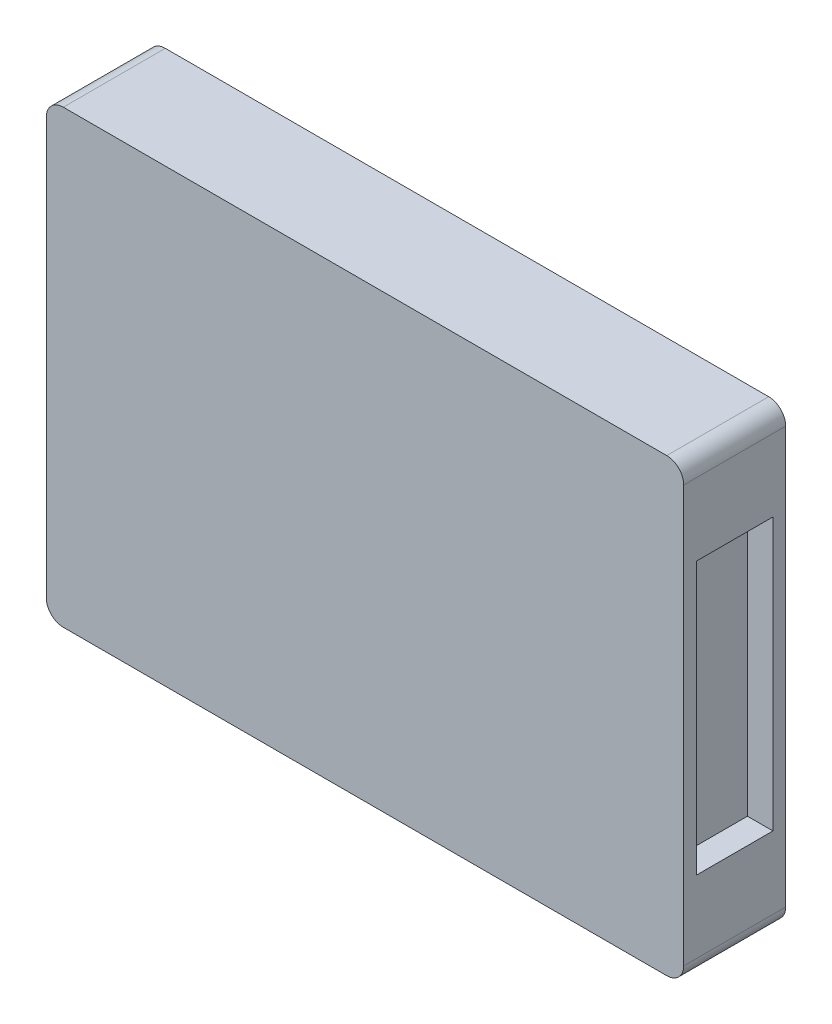
ISO-10303-21;
HEADER;
FILE_DESCRIPTION(('STEP AP214'),'2;1');
FILE_NAME('part.step','',(''),(''),'','','');
FILE_SCHEMA(('AUTOMOTIVE_DESIGN { 1 0 10303 214 1 1 1 1 }'));
ENDSEC;
DATA;
#1=APPLICATION_CONTEXT('core data for automotive mechanical design processes');
#2=APPLICATION_PROTOCOL_DEFINITION('international standard','automotive_design',2000,#1);
#3=PRODUCT_CONTEXT('',#1,'mechanical');
#4=PRODUCT('Part','Part','',(#3));
#5=PRODUCT_RELATED_PRODUCT_CATEGORY('part','',(#4));
#6=PRODUCT_DEFINITION_FORMATION('','',#4);
#7=PRODUCT_DEFINITION_CONTEXT('part definition',#1,'design');
#8=PRODUCT_DEFINITION('design','',#6,#7);
#9=PRODUCT_DEFINITION_SHAPE('','',#8);
#10=(LENGTH_UNIT() NAMED_UNIT(*) SI_UNIT(.MILLI.,.METRE.));
#11=(NAMED_UNIT(*) PLANE_ANGLE_UNIT() SI_UNIT($,.RADIAN.));
#12=(NAMED_UNIT(*) SI_UNIT($,.STERADIAN.) SOLID_ANGLE_UNIT());
#13=UNCERTAINTY_MEASURE_WITH_UNIT(LENGTH_MEASURE(1.E-05),#10,'distance_accuracy_value','');
#14=(GEOMETRIC_REPRESENTATION_CONTEXT(3) GLOBAL_UNCERTAINTY_ASSIGNED_CONTEXT((#13)) GLOBAL_UNIT_ASSIGNED_CONTEXT((#10,
#11,#12)) REPRESENTATION_CONTEXT('',''));
#15=CARTESIAN_POINT('',(0.,0.,0.));
#16=DIRECTION('',(0.,0.,1.));
#17=DIRECTION('',(1.,0.,0.));
#18=AXIS2_PLACEMENT_3D('',#15,#16,#17);
#19=CARTESIAN_POINT('',(-37.5,-26.5,12.));
#20=DIRECTION('',(1.,0.,0.));
#21=DIRECTION('',(0.,0.,-1.));
#22=AXIS2_PLACEMENT_3D('',#19,#20,#21);
#23=PLANE('',#22);
#24=DIRECTION('',(0.,1.,0.));
#25=VECTOR('',#24,1.);
#26=CARTESIAN_POINT('',(-37.5,-4.,8.5));
#27=LINE('',#26,#25);
#28=CARTESIAN_POINT('',(-37.5,-4.,8.5));
#29=VERTEX_POINT('',#28);
#30=CARTESIAN_POINT('',(-37.5,4.,8.5));
#31=VERTEX_POINT('',#30);
#32=EDGE_CURVE('E188',#29,#31,#27,.T.);
#33=ORIENTED_EDGE('',*,*,#32,.F.);
#34=CARTESIAN_POINT('',(-37.5,-4.,6.));
#35=DIRECTION('',(-1.,0.,0.));
#36=DIRECTION('',(0.,0.,1.));
#37=AXIS2_PLACEMENT_3D('',#34,#35,#36);
#38=CIRCLE('',#37,2.5);
#39=CARTESIAN_POINT('',(-37.5,-4.,3.5));
#40=VERTEX_POINT('',#39);
#41=EDGE_CURVE('E55',#40,#29,#38,.T.);
#42=ORIENTED_EDGE('',*,*,#41,.F.);
#43=DIRECTION('',(0.,-1.,0.));
#44=VECTOR('',#43,1.);
#45=CARTESIAN_POINT('',(-37.5,-4.,3.5));
#46=LINE('',#45,#44);
#47=CARTESIAN_POINT('',(-37.5,4.,3.5));
#48=VERTEX_POINT('',#47);
#49=EDGE_CURVE('E175',#48,#40,#46,.T.);
#50=ORIENTED_EDGE('',*,*,#49,.F.);
#51=CARTESIAN_POINT('',(-37.5,4.,6.));
#52=DIRECTION('',(-1.,0.,0.));
#53=DIRECTION('',(0.,0.,1.));
#54=AXIS2_PLACEMENT_3D('',#51,#52,#53);
#55=CIRCLE('',#54,2.5);
#56=EDGE_CURVE('E179',#31,#48,#55,.T.);
#57=ORIENTED_EDGE('',*,*,#56,.F.);
#58=EDGE_LOOP('',(#33,#42,#50,#57));
#59=FACE_BOUND('',#58,.T.);
#60=DIRECTION('',(0.,-1.,0.));
#61=VECTOR('',#60,1.);
#62=CARTESIAN_POINT('',(-37.5,-26.5,0.));
#63=LINE('',#62,#61);
#64=CARTESIAN_POINT('',(-37.5,24.5,0.));
#65=VERTEX_POINT('',#64);
#66=CARTESIAN_POINT('',(-37.5,-24.5,0.));
#67=VERTEX_POINT('',#66);
#68=EDGE_CURVE('E236',#65,#67,#63,.T.);
#69=ORIENTED_EDGE('',*,*,#68,.T.);
#70=DIRECTION('',(0.,0.,-1.));
#71=VECTOR('',#70,1.);
#72=CARTESIAN_POINT('',(-37.5,-24.5,12.));
#73=LINE('',#72,#71);
#74=CARTESIAN_POINT('',(-37.5,-24.5,12.));
#75=VERTEX_POINT('',#74);
#76=EDGE_CURVE('E11',#67,#75,#73,.F.);
#77=ORIENTED_EDGE('',*,*,#76,.T.);
#78=DIRECTION('',(0.,-1.,0.));
#79=VECTOR('',#78,1.);
#80=CARTESIAN_POINT('',(-37.5,-26.5,12.));
#81=LINE('',#80,#79);
#82=CARTESIAN_POINT('',(-37.5,24.5,12.));
#83=VERTEX_POINT('',#82);
#84=EDGE_CURVE('E245',#83,#75,#81,.T.);
#85=ORIENTED_EDGE('',*,*,#84,.F.);
#86=DIRECTION('',(0.,0.,-1.));
#87=VECTOR('',#86,1.);
#88=CARTESIAN_POINT('',(-37.5,24.5,12.));
#89=LINE('',#88,#87);
#90=EDGE_CURVE('E48',#83,#65,#89,.T.);
#91=ORIENTED_EDGE('',*,*,#90,.T.);
#92=EDGE_LOOP('',(#69,#77,#85,#91));
#93=FACE_BOUND('',#92,.T.);
#94=ADVANCED_FACE('F39',(#59,#93),#23,.F.);
#95=CARTESIAN_POINT('',(37.5,-26.5,12.));
#96=DIRECTION('',(0.,1.,0.));
#97=DIRECTION('',(-1.,0.,0.));
#98=AXIS2_PLACEMENT_3D('',#95,#96,#97);
#99=PLANE('',#98);
#100=DIRECTION('',(1.,0.,0.));
#101=VECTOR('',#100,1.);
#102=CARTESIAN_POINT('',(37.5,-26.5,0.));
#103=LINE('',#102,#101);
#104=CARTESIAN_POINT('',(-35.5,-26.5,0.));
#105=VERTEX_POINT('',#104);
#106=CARTESIAN_POINT('',(35.5,-26.5,0.));
#107=VERTEX_POINT('',#106);
#108=EDGE_CURVE('E266',#105,#107,#103,.T.);
#109=ORIENTED_EDGE('',*,*,#108,.T.);
#110=DIRECTION('',(0.,0.,-1.));
#111=VECTOR('',#110,1.);
#112=CARTESIAN_POINT('',(35.5,-26.5,12.));
#113=LINE('',#112,#111);
#114=CARTESIAN_POINT('',(35.5,-26.5,12.));
#115=VERTEX_POINT('',#114);
#116=EDGE_CURVE('E318',#107,#115,#113,.F.);
#117=ORIENTED_EDGE('',*,*,#116,.T.);
#118=DIRECTION('',(1.,0.,0.));
#119=VECTOR('',#118,1.);
#120=CARTESIAN_POINT('',(37.5,-26.5,12.));
#121=LINE('',#120,#119);
#122=CARTESIAN_POINT('',(-35.5,-26.5,12.));
#123=VERTEX_POINT('',#122);
#124=EDGE_CURVE('E249',#123,#115,#121,.T.);
#125=ORIENTED_EDGE('',*,*,#124,.F.);
#126=DIRECTION('',(0.,0.,-1.));
#127=VECTOR('',#126,1.);
#128=CARTESIAN_POINT('',(-35.5,-26.5,12.));
#129=LINE('',#128,#127);
#130=EDGE_CURVE('E314',#123,#105,#129,.T.);
#131=ORIENTED_EDGE('',*,*,#130,.T.);
#132=EDGE_LOOP('',(#109,#117,#125,#131));
#133=FACE_BOUND('',#132,.T.);
#134=ADVANCED_FACE('F339',(#133),#99,.F.);
#135=CARTESIAN_POINT('',(37.5,-26.5,12.));
#136=DIRECTION('',(-1.,0.,0.));
#137=DIRECTION('',(0.,0.,1.));
#138=AXIS2_PLACEMENT_3D('',#135,#136,#137);
#139=PLANE('',#138);
#140=DIRECTION('',(0.,0.,-1.));
#141=VECTOR('',#140,1.);
#142=CARTESIAN_POINT('',(37.5,-16.,1.5));
#143=LINE('',#142,#141);
#144=CARTESIAN_POINT('',(37.5,-16.,10.5));
#145=VERTEX_POINT('',#144);
#146=CARTESIAN_POINT('',(37.5,-16.,1.5));
#147=VERTEX_POINT('',#146);
#148=EDGE_CURVE('E222',#145,#147,#143,.T.);
#149=ORIENTED_EDGE('',*,*,#148,.F.);
#150=DIRECTION('',(0.,-1.,0.));
#151=VECTOR('',#150,1.);
#152=CARTESIAN_POINT('',(37.5,-16.,10.5));
#153=LINE('',#152,#151);
#154=CARTESIAN_POINT('',(37.5,16.,10.5));
#155=VERTEX_POINT('',#154);
#156=EDGE_CURVE('E63',#155,#145,#153,.T.);
#157=ORIENTED_EDGE('',*,*,#156,.F.);
#158=DIRECTION('',(0.,0.,1.));
#159=VECTOR('',#158,1.);
#160=CARTESIAN_POINT('',(37.5,16.,1.5));
#161=LINE('',#160,#159);
#162=CARTESIAN_POINT('',(37.5,16.,1.5));
#163=VERTEX_POINT('',#162);
#164=EDGE_CURVE('E207',#163,#155,#161,.T.);
#165=ORIENTED_EDGE('',*,*,#164,.F.);
#166=DIRECTION('',(0.,1.,0.));
#167=VECTOR('',#166,1.);
#168=CARTESIAN_POINT('',(37.5,-16.,1.5));
#169=LINE('',#168,#167);
#170=EDGE_CURVE('E226',#147,#163,#169,.T.);
#171=ORIENTED_EDGE('',*,*,#170,.F.);
#172=EDGE_LOOP('',(#149,#157,#165,#171));
#173=FACE_BOUND('',#172,.T.);
#174=DIRECTION('',(0.,1.,0.));
#175=VECTOR('',#174,1.);
#176=CARTESIAN_POINT('',(37.5,-26.5,0.));
#177=LINE('',#176,#175);
#178=CARTESIAN_POINT('',(37.5,-24.5,0.));
#179=VERTEX_POINT('',#178);
#180=CARTESIAN_POINT('',(37.5,24.5,0.));
#181=VERTEX_POINT('',#180);
#182=EDGE_CURVE('E270',#179,#181,#177,.T.);
#183=ORIENTED_EDGE('',*,*,#182,.T.);
#184=DIRECTION('',(0.,0.,-1.));
#185=VECTOR('',#184,1.);
#186=CARTESIAN_POINT('',(37.5,24.5,12.));
#187=LINE('',#186,#185);
#188=CARTESIAN_POINT('',(37.5,24.5,12.));
#189=VERTEX_POINT('',#188);
#190=EDGE_CURVE('E299',#181,#189,#187,.F.);
#191=ORIENTED_EDGE('',*,*,#190,.T.);
#192=DIRECTION('',(0.,1.,0.));
#193=VECTOR('',#192,1.);
#194=CARTESIAN_POINT('',(37.5,-26.5,12.));
#195=LINE('',#194,#193);
#196=CARTESIAN_POINT('',(37.5,-24.5,12.));
#197=VERTEX_POINT('',#196);
#198=EDGE_CURVE('E254',#197,#189,#195,.T.);
#199=ORIENTED_EDGE('',*,*,#198,.F.);
#200=DIRECTION('',(0.,0.,-1.));
#201=VECTOR('',#200,1.);
#202=CARTESIAN_POINT('',(37.5,-24.5,12.));
#203=LINE('',#202,#201);
#204=EDGE_CURVE('E295',#197,#179,#203,.T.);
#205=ORIENTED_EDGE('',*,*,#204,.T.);
#206=EDGE_LOOP('',(#183,#191,#199,#205));
#207=FACE_BOUND('',#206,.T.);
#208=ADVANCED_FACE('F350',(#173,#207),#139,.F.);
#209=CARTESIAN_POINT('',(37.5,26.5,12.));
#210=DIRECTION('',(0.,-1.,0.));
#211=DIRECTION('',(1.,0.,0.));
#212=AXIS2_PLACEMENT_3D('',#209,#210,#211);
#213=PLANE('',#212);
#214=DIRECTION('',(-1.,0.,0.));
#215=VECTOR('',#214,1.);
#216=CARTESIAN_POINT('',(37.5,26.5,12.));
#217=LINE('',#216,#215);
#218=CARTESIAN_POINT('',(35.5,26.5,12.));
#219=VERTEX_POINT('',#218);
#220=CARTESIAN_POINT('',(-35.5,26.5,12.));
#221=VERTEX_POINT('',#220);
#222=EDGE_CURVE('E258',#219,#221,#217,.T.);
#223=ORIENTED_EDGE('',*,*,#222,.F.);
#224=DIRECTION('',(0.,0.,-1.));
#225=VECTOR('',#224,1.);
#226=CARTESIAN_POINT('',(35.5,26.5,12.));
#227=LINE('',#226,#225);
#228=CARTESIAN_POINT('',(35.5,26.5,0.));
#229=VERTEX_POINT('',#228);
#230=EDGE_CURVE('E279',#219,#229,#227,.T.);
#231=ORIENTED_EDGE('',*,*,#230,.T.);
#232=DIRECTION('',(-1.,0.,0.));
#233=VECTOR('',#232,1.);
#234=CARTESIAN_POINT('',(37.5,26.5,0.));
#235=LINE('',#234,#233);
#236=CARTESIAN_POINT('',(-35.5,26.5,0.));
#237=VERTEX_POINT('',#236);
#238=EDGE_CURVE('E250',#229,#237,#235,.T.);
#239=ORIENTED_EDGE('',*,*,#238,.T.);
#240=DIRECTION('',(0.,0.,-1.));
#241=VECTOR('',#240,1.);
#242=CARTESIAN_POINT('',(-35.5,26.5,12.));
#243=LINE('',#242,#241);
#244=EDGE_CURVE('E262',#237,#221,#243,.F.);
#245=ORIENTED_EDGE('',*,*,#244,.T.);
#246=EDGE_LOOP('',(#223,#231,#239,#245));
#247=FACE_BOUND('',#246,.T.);
#248=ADVANCED_FACE('F358',(#247),#213,.F.);
#249=CARTESIAN_POINT('',(0.,0.,12.));
#250=DIRECTION('',(0.,0.,1.));
#251=DIRECTION('',(1.,0.,0.));
#252=AXIS2_PLACEMENT_3D('',#249,#250,#251);
#253=PLANE('',#252);
#254=ORIENTED_EDGE('',*,*,#198,.T.);
#255=CARTESIAN_POINT('',(35.5,24.5,12.));
#256=DIRECTION('',(0.,0.,1.));
#257=DIRECTION('',(1.,0.,0.));
#258=AXIS2_PLACEMENT_3D('',#255,#256,#257);
#259=CIRCLE('',#258,2.);
#260=EDGE_CURVE('E311',#189,#219,#259,.T.);
#261=ORIENTED_EDGE('',*,*,#260,.T.);
#262=ORIENTED_EDGE('',*,*,#222,.T.);
#263=CARTESIAN_POINT('',(-35.5,24.5,12.));
#264=DIRECTION('',(0.,0.,1.));
#265=DIRECTION('',(1.,0.,0.));
#266=AXIS2_PLACEMENT_3D('',#263,#264,#265);
#267=CIRCLE('',#266,2.);
#268=EDGE_CURVE('E302',#221,#83,#267,.T.);
#269=ORIENTED_EDGE('',*,*,#268,.T.);
#270=ORIENTED_EDGE('',*,*,#84,.T.);
#271=CARTESIAN_POINT('',(-35.5,-24.5,12.));
#272=DIRECTION('',(0.,0.,1.));
#273=DIRECTION('',(1.,0.,0.));
#274=AXIS2_PLACEMENT_3D('',#271,#272,#273);
#275=CIRCLE('',#274,2.);
#276=EDGE_CURVE('E305',#75,#123,#275,.T.);
#277=ORIENTED_EDGE('',*,*,#276,.T.);
#278=ORIENTED_EDGE('',*,*,#124,.T.);
#279=CARTESIAN_POINT('',(35.5,-24.5,12.));
#280=DIRECTION('',(0.,0.,1.));
#281=DIRECTION('',(1.,0.,0.));
#282=AXIS2_PLACEMENT_3D('',#279,#280,#281);
#283=CIRCLE('',#282,2.);
#284=EDGE_CURVE('E308',#115,#197,#283,.T.);
#285=ORIENTED_EDGE('',*,*,#284,.T.);
#286=EDGE_LOOP('',(#254,#261,#262,#269,#270,#277,#278,#285));
#287=FACE_BOUND('',#286,.T.);
#288=ADVANCED_FACE('F343',(#287),#253,.T.);
#289=CARTESIAN_POINT('',(0.,0.,0.));
#290=DIRECTION('',(0.,0.,1.));
#291=DIRECTION('',(1.,0.,0.));
#292=AXIS2_PLACEMENT_3D('',#289,#290,#291);
#293=PLANE('',#292);
#294=ORIENTED_EDGE('',*,*,#238,.F.);
#295=CARTESIAN_POINT('',(35.5,24.5,0.));
#296=DIRECTION('',(0.,0.,1.));
#297=DIRECTION('',(1.,0.,0.));
#298=AXIS2_PLACEMENT_3D('',#295,#296,#297);
#299=CIRCLE('',#298,2.);
#300=EDGE_CURVE('E292',#229,#181,#299,.F.);
#301=ORIENTED_EDGE('',*,*,#300,.T.);
#302=ORIENTED_EDGE('',*,*,#182,.F.);
#303=CARTESIAN_POINT('',(35.5,-24.5,0.));
#304=DIRECTION('',(0.,0.,1.));
#305=DIRECTION('',(1.,0.,0.));
#306=AXIS2_PLACEMENT_3D('',#303,#304,#305);
#307=CIRCLE('',#306,2.);
#308=EDGE_CURVE('E289',#179,#107,#307,.F.);
#309=ORIENTED_EDGE('',*,*,#308,.T.);
#310=ORIENTED_EDGE('',*,*,#108,.F.);
#311=CARTESIAN_POINT('',(-35.5,-24.5,0.));
#312=DIRECTION('',(0.,0.,1.));
#313=DIRECTION('',(1.,0.,0.));
#314=AXIS2_PLACEMENT_3D('',#311,#312,#313);
#315=CIRCLE('',#314,2.);
#316=EDGE_CURVE('E286',#105,#67,#315,.F.);
#317=ORIENTED_EDGE('',*,*,#316,.T.);
#318=ORIENTED_EDGE('',*,*,#68,.F.);
#319=CARTESIAN_POINT('',(-35.5,24.5,0.));
#320=DIRECTION('',(0.,0.,1.));
#321=DIRECTION('',(1.,0.,0.));
#322=AXIS2_PLACEMENT_3D('',#319,#320,#321);
#323=CIRCLE('',#322,2.);
#324=EDGE_CURVE('E283',#65,#237,#323,.F.);
#325=ORIENTED_EDGE('',*,*,#324,.T.);
#326=EDGE_LOOP('',(#294,#301,#302,#309,#310,#317,#318,#325));
#327=FACE_BOUND('',#326,.T.);
#328=ADVANCED_FACE('F331',(#327),#293,.F.);
#329=CARTESIAN_POINT('',(35.5,24.5,12.));
#330=DIRECTION('',(0.,0.,-1.));
#331=DIRECTION('',(-1.,0.,0.));
#332=AXIS2_PLACEMENT_3D('',#329,#330,#331);
#333=CYLINDRICAL_SURFACE('',#332,2.);
#334=ORIENTED_EDGE('',*,*,#260,.F.);
#335=ORIENTED_EDGE('',*,*,#190,.F.);
#336=ORIENTED_EDGE('',*,*,#300,.F.);
#337=ORIENTED_EDGE('',*,*,#230,.F.);
#338=EDGE_LOOP('',(#334,#335,#336,#337));
#339=FACE_BOUND('',#338,.T.);
#340=ADVANCED_FACE('F355',(#339),#333,.T.);
#341=CARTESIAN_POINT('',(35.5,-24.5,12.));
#342=DIRECTION('',(0.,0.,-1.));
#343=DIRECTION('',(-1.,0.,0.));
#344=AXIS2_PLACEMENT_3D('',#341,#342,#343);
#345=CYLINDRICAL_SURFACE('',#344,2.);
#346=ORIENTED_EDGE('',*,*,#284,.F.);
#347=ORIENTED_EDGE('',*,*,#116,.F.);
#348=ORIENTED_EDGE('',*,*,#308,.F.);
#349=ORIENTED_EDGE('',*,*,#204,.F.);
#350=EDGE_LOOP('',(#346,#347,#348,#349));
#351=FACE_BOUND('',#350,.T.);
#352=ADVANCED_FACE('F347',(#351),#345,.T.);
#353=CARTESIAN_POINT('',(-35.5,-24.5,12.));
#354=DIRECTION('',(0.,0.,-1.));
#355=DIRECTION('',(-1.,0.,0.));
#356=AXIS2_PLACEMENT_3D('',#353,#354,#355);
#357=CYLINDRICAL_SURFACE('',#356,2.);
#358=ORIENTED_EDGE('',*,*,#276,.F.);
#359=ORIENTED_EDGE('',*,*,#76,.F.);
#360=ORIENTED_EDGE('',*,*,#316,.F.);
#361=ORIENTED_EDGE('',*,*,#130,.F.);
#362=EDGE_LOOP('',(#358,#359,#360,#361));
#363=FACE_BOUND('',#362,.T.);
#364=ADVANCED_FACE('F336',(#363),#357,.T.);
#365=CARTESIAN_POINT('',(-35.5,24.5,12.));
#366=DIRECTION('',(0.,0.,-1.));
#367=DIRECTION('',(-1.,0.,0.));
#368=AXIS2_PLACEMENT_3D('',#365,#366,#367);
#369=CYLINDRICAL_SURFACE('',#368,2.);
#370=ORIENTED_EDGE('',*,*,#268,.F.);
#371=ORIENTED_EDGE('',*,*,#244,.F.);
#372=ORIENTED_EDGE('',*,*,#324,.F.);
#373=ORIENTED_EDGE('',*,*,#90,.F.);
#374=EDGE_LOOP('',(#370,#371,#372,#373));
#375=FACE_BOUND('',#374,.T.);
#376=ADVANCED_FACE('F41',(#375),#369,.T.);
#377=CARTESIAN_POINT('',(34.5,-16.,10.5));
#378=DIRECTION('',(0.,0.,1.));
#379=DIRECTION('',(0.,-1.,0.));
#380=AXIS2_PLACEMENT_3D('',#377,#378,#379);
#381=PLANE('',#380);
#382=ORIENTED_EDGE('',*,*,#156,.T.);
#383=DIRECTION('',(1.,0.,0.));
#384=VECTOR('',#383,1.);
#385=CARTESIAN_POINT('',(34.5,-16.,10.5));
#386=LINE('',#385,#384);
#387=CARTESIAN_POINT('',(34.5,-16.,10.5));
#388=VERTEX_POINT('',#387);
#389=EDGE_CURVE('E219',#388,#145,#386,.T.);
#390=ORIENTED_EDGE('',*,*,#389,.F.);
#391=DIRECTION('',(0.,-1.,0.));
#392=VECTOR('',#391,1.);
#393=CARTESIAN_POINT('',(34.5,-16.,10.5));
#394=LINE('',#393,#392);
#395=CARTESIAN_POINT('',(34.5,16.,10.5));
#396=VERTEX_POINT('',#395);
#397=EDGE_CURVE('E202',#396,#388,#394,.T.);
#398=ORIENTED_EDGE('',*,*,#397,.F.);
#399=DIRECTION('',(1.,0.,0.));
#400=VECTOR('',#399,1.);
#401=CARTESIAN_POINT('',(34.5,16.,10.5));
#402=LINE('',#401,#400);
#403=EDGE_CURVE('E233',#396,#155,#402,.T.);
#404=ORIENTED_EDGE('',*,*,#403,.T.);
#405=EDGE_LOOP('',(#382,#390,#398,#404));
#406=FACE_BOUND('',#405,.T.);
#407=ADVANCED_FACE('F361',(#406),#381,.F.);
#408=CARTESIAN_POINT('',(34.5,16.,1.5));
#409=DIRECTION('',(0.,1.,0.));
#410=DIRECTION('',(0.,0.,1.));
#411=AXIS2_PLACEMENT_3D('',#408,#409,#410);
#412=PLANE('',#411);
#413=ORIENTED_EDGE('',*,*,#164,.T.);
#414=ORIENTED_EDGE('',*,*,#403,.F.);
#415=DIRECTION('',(0.,0.,1.));
#416=VECTOR('',#415,1.);
#417=CARTESIAN_POINT('',(34.5,16.,1.5));
#418=LINE('',#417,#416);
#419=CARTESIAN_POINT('',(34.5,16.,1.5));
#420=VERTEX_POINT('',#419);
#421=EDGE_CURVE('E215',#420,#396,#418,.T.);
#422=ORIENTED_EDGE('',*,*,#421,.F.);
#423=DIRECTION('',(1.,0.,0.));
#424=VECTOR('',#423,1.);
#425=CARTESIAN_POINT('',(34.5,16.,1.5));
#426=LINE('',#425,#424);
#427=EDGE_CURVE('E237',#420,#163,#426,.T.);
#428=ORIENTED_EDGE('',*,*,#427,.T.);
#429=EDGE_LOOP('',(#413,#414,#422,#428));
#430=FACE_BOUND('',#429,.T.);
#431=ADVANCED_FACE('F366',(#430),#412,.F.);
#432=CARTESIAN_POINT('',(34.5,-16.,1.5));
#433=DIRECTION('',(0.,0.,-1.));
#434=DIRECTION('',(-1.,0.,0.));
#435=AXIS2_PLACEMENT_3D('',#432,#433,#434);
#436=PLANE('',#435);
#437=ORIENTED_EDGE('',*,*,#170,.T.);
#438=ORIENTED_EDGE('',*,*,#427,.F.);
#439=DIRECTION('',(0.,1.,0.));
#440=VECTOR('',#439,1.);
#441=CARTESIAN_POINT('',(34.5,-16.,1.5));
#442=LINE('',#441,#440);
#443=CARTESIAN_POINT('',(34.5,-16.,1.5));
#444=VERTEX_POINT('',#443);
#445=EDGE_CURVE('E211',#444,#420,#442,.T.);
#446=ORIENTED_EDGE('',*,*,#445,.F.);
#447=DIRECTION('',(1.,0.,0.));
#448=VECTOR('',#447,1.);
#449=CARTESIAN_POINT('',(34.5,-16.,1.5));
#450=LINE('',#449,#448);
#451=EDGE_CURVE('E240',#444,#147,#450,.T.);
#452=ORIENTED_EDGE('',*,*,#451,.T.);
#453=EDGE_LOOP('',(#437,#438,#446,#452));
#454=FACE_BOUND('',#453,.T.);
#455=ADVANCED_FACE('F419',(#454),#436,.F.);
#456=CARTESIAN_POINT('',(34.5,-16.,1.5));
#457=DIRECTION('',(0.,-1.,0.));
#458=DIRECTION('',(0.,0.,-1.));
#459=AXIS2_PLACEMENT_3D('',#456,#457,#458);
#460=PLANE('',#459);
#461=ORIENTED_EDGE('',*,*,#148,.T.);
#462=ORIENTED_EDGE('',*,*,#451,.F.);
#463=DIRECTION('',(0.,0.,-1.));
#464=VECTOR('',#463,1.);
#465=CARTESIAN_POINT('',(34.5,-16.,1.5));
#466=LINE('',#465,#464);
#467=EDGE_CURVE('E206',#388,#444,#466,.T.);
#468=ORIENTED_EDGE('',*,*,#467,.F.);
#469=ORIENTED_EDGE('',*,*,#389,.T.);
#470=EDGE_LOOP('',(#461,#462,#468,#469));
#471=FACE_BOUND('',#470,.T.);
#472=ADVANCED_FACE('F429',(#471),#460,.F.);
#473=CARTESIAN_POINT('',(34.5,0.,0.));
#474=DIRECTION('',(1.,0.,0.));
#475=DIRECTION('',(0.,0.,-1.));
#476=AXIS2_PLACEMENT_3D('',#473,#474,#475);
#477=PLANE('',#476);
#478=ORIENTED_EDGE('',*,*,#397,.T.);
#479=ORIENTED_EDGE('',*,*,#467,.T.);
#480=ORIENTED_EDGE('',*,*,#445,.T.);
#481=ORIENTED_EDGE('',*,*,#421,.T.);
#482=EDGE_LOOP('',(#478,#479,#480,#481));
#483=FACE_BOUND('',#482,.T.);
#484=ADVANCED_FACE('F439',(#483),#477,.T.);
#485=CARTESIAN_POINT('',(-34.5,-4.,6.));
#486=DIRECTION('',(-1.,0.,0.));
#487=DIRECTION('',(0.,0.,1.));
#488=AXIS2_PLACEMENT_3D('',#485,#486,#487);
#489=CYLINDRICAL_SURFACE('',#488,2.5);
#490=ORIENTED_EDGE('',*,*,#41,.T.);
#491=DIRECTION('',(-1.,0.,0.));
#492=VECTOR('',#491,1.);
#493=CARTESIAN_POINT('',(-34.5,-4.,8.5));
#494=LINE('',#493,#492);
#495=CARTESIAN_POINT('',(-34.5,-4.,8.5));
#496=VERTEX_POINT('',#495);
#497=EDGE_CURVE('E150',#496,#29,#494,.T.);
#498=ORIENTED_EDGE('',*,*,#497,.F.);
#499=CARTESIAN_POINT('',(-34.5,-4.,6.));
#500=DIRECTION('',(-1.,0.,0.));
#501=DIRECTION('',(0.,0.,1.));
#502=AXIS2_PLACEMENT_3D('',#499,#500,#501);
#503=CIRCLE('',#502,2.5);
#504=CARTESIAN_POINT('',(-34.5,-4.,3.5));
#505=VERTEX_POINT('',#504);
#506=EDGE_CURVE('E154',#505,#496,#503,.T.);
#507=ORIENTED_EDGE('',*,*,#506,.F.);
#508=DIRECTION('',(-1.,0.,0.));
#509=VECTOR('',#508,1.);
#510=CARTESIAN_POINT('',(-34.5,-4.,3.5));
#511=LINE('',#510,#509);
#512=EDGE_CURVE('E194',#505,#40,#511,.T.);
#513=ORIENTED_EDGE('',*,*,#512,.T.);
#514=EDGE_LOOP('',(#490,#498,#507,#513));
#515=FACE_BOUND('',#514,.T.);
#516=ADVANCED_FACE('F152',(#515),#489,.F.);
#517=CARTESIAN_POINT('',(-34.5,-4.,3.5));
#518=DIRECTION('',(0.,0.,-1.));
#519=DIRECTION('',(-1.,0.,0.));
#520=AXIS2_PLACEMENT_3D('',#517,#518,#519);
#521=PLANE('',#520);
#522=ORIENTED_EDGE('',*,*,#49,.T.);
#523=ORIENTED_EDGE('',*,*,#512,.F.);
#524=DIRECTION('',(0.,-1.,0.));
#525=VECTOR('',#524,1.);
#526=CARTESIAN_POINT('',(-34.5,-4.,3.5));
#527=LINE('',#526,#525);
#528=CARTESIAN_POINT('',(-34.5,4.,3.5));
#529=VERTEX_POINT('',#528);
#530=EDGE_CURVE('E161',#529,#505,#527,.T.);
#531=ORIENTED_EDGE('',*,*,#530,.F.);
#532=DIRECTION('',(-1.,0.,0.));
#533=VECTOR('',#532,1.);
#534=CARTESIAN_POINT('',(-34.5,4.,3.5));
#535=LINE('',#534,#533);
#536=EDGE_CURVE('E197',#529,#48,#535,.T.);
#537=ORIENTED_EDGE('',*,*,#536,.T.);
#538=EDGE_LOOP('',(#522,#523,#531,#537));
#539=FACE_BOUND('',#538,.T.);
#540=ADVANCED_FACE('F462',(#539),#521,.F.);
#541=CARTESIAN_POINT('',(-34.5,4.,6.));
#542=DIRECTION('',(-1.,0.,0.));
#543=DIRECTION('',(0.,0.,1.));
#544=AXIS2_PLACEMENT_3D('',#541,#542,#543);
#545=CYLINDRICAL_SURFACE('',#544,2.5);
#546=ORIENTED_EDGE('',*,*,#56,.T.);
#547=ORIENTED_EDGE('',*,*,#536,.F.);
#548=CARTESIAN_POINT('',(-34.5,4.,6.));
#549=DIRECTION('',(-1.,0.,0.));
#550=DIRECTION('',(0.,0.,1.));
#551=AXIS2_PLACEMENT_3D('',#548,#549,#550);
#552=CIRCLE('',#551,2.5);
#553=CARTESIAN_POINT('',(-34.5,4.,8.5));
#554=VERTEX_POINT('',#553);
#555=EDGE_CURVE('E170',#554,#529,#552,.T.);
#556=ORIENTED_EDGE('',*,*,#555,.F.);
#557=DIRECTION('',(-1.,0.,0.));
#558=VECTOR('',#557,1.);
#559=CARTESIAN_POINT('',(-34.5,4.,8.5));
#560=LINE('',#559,#558);
#561=EDGE_CURVE('E160',#554,#31,#560,.T.);
#562=ORIENTED_EDGE('',*,*,#561,.T.);
#563=EDGE_LOOP('',(#546,#547,#556,#562));
#564=FACE_BOUND('',#563,.T.);
#565=ADVANCED_FACE('F471',(#564),#545,.F.);
#566=CARTESIAN_POINT('',(-34.5,-4.,8.5));
#567=DIRECTION('',(0.,0.,1.));
#568=DIRECTION('',(1.,0.,0.));
#569=AXIS2_PLACEMENT_3D('',#566,#567,#568);
#570=PLANE('',#569);
#571=ORIENTED_EDGE('',*,*,#32,.T.);
#572=ORIENTED_EDGE('',*,*,#561,.F.);
#573=DIRECTION('',(0.,1.,0.));
#574=VECTOR('',#573,1.);
#575=CARTESIAN_POINT('',(-34.5,-4.,8.5));
#576=LINE('',#575,#574);
#577=EDGE_CURVE('E164',#496,#554,#576,.T.);
#578=ORIENTED_EDGE('',*,*,#577,.F.);
#579=ORIENTED_EDGE('',*,*,#497,.T.);
#580=EDGE_LOOP('',(#571,#572,#578,#579));
#581=FACE_BOUND('',#580,.T.);
#582=ADVANCED_FACE('F165',(#581),#570,.F.);
#583=CARTESIAN_POINT('',(-34.5,-4.,6.));
#584=DIRECTION('',(-1.,0.,0.));
#585=DIRECTION('',(0.,0.,1.));
#586=AXIS2_PLACEMENT_3D('',#583,#584,#585);
#587=PLANE('',#586);
#588=ORIENTED_EDGE('',*,*,#506,.T.);
#589=ORIENTED_EDGE('',*,*,#577,.T.);
#590=ORIENTED_EDGE('',*,*,#555,.T.);
#591=ORIENTED_EDGE('',*,*,#530,.T.);
#592=EDGE_LOOP('',(#588,#589,#590,#591));
#593=FACE_BOUND('',#592,.T.);
#594=ADVANCED_FACE('F172',(#593),#587,.T.);
#595=CLOSED_SHELL('',(#94,#134,#208,#248,#288,#328,#340,#352,#364,#376,#407,#431,#455,#472,#484,
#516,#540,#565,#582,#594));
#596=MANIFOLD_SOLID_BREP('B2',#595);
#597=ADVANCED_BREP_SHAPE_REPRESENTATION('',(#18,#596),#14);
#598=SHAPE_DEFINITION_REPRESENTATION(#9,#597);
ENDSEC;
END-ISO-10303-21;
